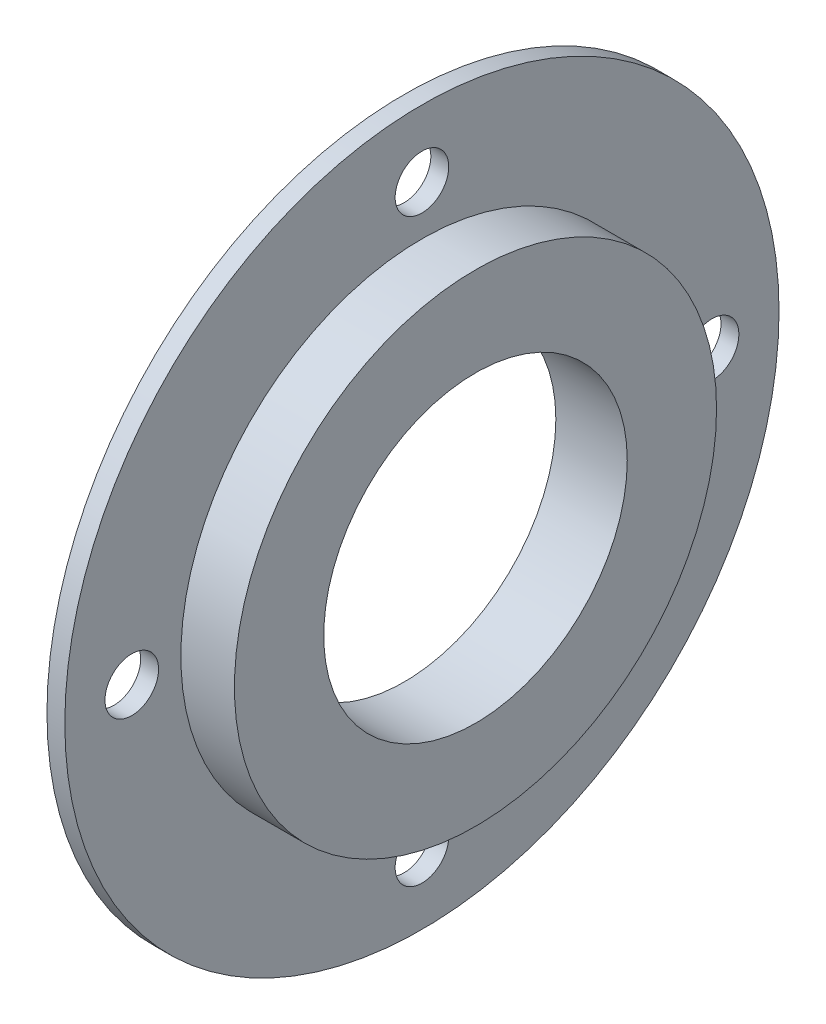
ISO-10303-21;
HEADER;
FILE_DESCRIPTION(('STEP AP214'),'2;1');
FILE_NAME('part.step','',(''),(''),'','','');
FILE_SCHEMA(('AUTOMOTIVE_DESIGN { 1 0 10303 214 1 1 1 1 }'));
ENDSEC;
DATA;
#1=APPLICATION_CONTEXT('core data for automotive mechanical design processes');
#2=APPLICATION_PROTOCOL_DEFINITION('international standard','automotive_design',2000,#1);
#3=PRODUCT_CONTEXT('',#1,'mechanical');
#4=PRODUCT('Part','Part','',(#3));
#5=PRODUCT_RELATED_PRODUCT_CATEGORY('part','',(#4));
#6=PRODUCT_DEFINITION_FORMATION('','',#4);
#7=PRODUCT_DEFINITION_CONTEXT('part definition',#1,'design');
#8=PRODUCT_DEFINITION('design','',#6,#7);
#9=PRODUCT_DEFINITION_SHAPE('','',#8);
#10=(LENGTH_UNIT() NAMED_UNIT(*) SI_UNIT(.MILLI.,.METRE.));
#11=(NAMED_UNIT(*) PLANE_ANGLE_UNIT() SI_UNIT($,.RADIAN.));
#12=(NAMED_UNIT(*) SI_UNIT($,.STERADIAN.) SOLID_ANGLE_UNIT());
#13=UNCERTAINTY_MEASURE_WITH_UNIT(LENGTH_MEASURE(1.E-05),#10,'distance_accuracy_value','');
#14=(GEOMETRIC_REPRESENTATION_CONTEXT(3) GLOBAL_UNCERTAINTY_ASSIGNED_CONTEXT((#13)) GLOBAL_UNIT_ASSIGNED_CONTEXT((#10,
#11,#12)) REPRESENTATION_CONTEXT('',''));
#15=CARTESIAN_POINT('',(0.,0.,0.));
#16=DIRECTION('',(0.,0.,1.));
#17=DIRECTION('',(1.,0.,0.));
#18=AXIS2_PLACEMENT_3D('',#15,#16,#17);
#19=CARTESIAN_POINT('',(0.,0.,0.));
#20=DIRECTION('',(-1.,0.,0.));
#21=DIRECTION('',(0.,0.,1.));
#22=AXIS2_PLACEMENT_3D('',#19,#20,#21);
#23=PLANE('',#22);
#24=CARTESIAN_POINT('',(0.,-32.5,0.));
#25=DIRECTION('',(-1.,0.,0.));
#26=DIRECTION('',(0.,0.,1.));
#27=AXIS2_PLACEMENT_3D('',#24,#25,#26);
#28=CIRCLE('',#27,3.);
#29=CARTESIAN_POINT('',(0.,-32.5,3.));
#30=VERTEX_POINT('',#29);
#31=EDGE_CURVE('E66',#30,#30,#28,.T.);
#32=ORIENTED_EDGE('',*,*,#31,.F.);
#33=EDGE_LOOP('',(#32));
#34=FACE_BOUND('',#33,.T.);
#35=CARTESIAN_POINT('',(0.,0.,-32.5));
#36=DIRECTION('',(-1.,0.,0.));
#37=DIRECTION('',(0.,0.,1.));
#38=AXIS2_PLACEMENT_3D('',#35,#36,#37);
#39=CIRCLE('',#38,3.);
#40=CARTESIAN_POINT('',(0.,0.,-29.5));
#41=VERTEX_POINT('',#40);
#42=EDGE_CURVE('E55',#41,#41,#39,.T.);
#43=ORIENTED_EDGE('',*,*,#42,.F.);
#44=EDGE_LOOP('',(#43));
#45=FACE_BOUND('',#44,.T.);
#46=CARTESIAN_POINT('',(0.,32.5,0.));
#47=DIRECTION('',(-1.,0.,0.));
#48=DIRECTION('',(0.,0.,1.));
#49=AXIS2_PLACEMENT_3D('',#46,#47,#48);
#50=CIRCLE('',#49,3.);
#51=CARTESIAN_POINT('',(0.,32.5,3.));
#52=VERTEX_POINT('',#51);
#53=EDGE_CURVE('E52',#52,#52,#50,.T.);
#54=ORIENTED_EDGE('',*,*,#53,.F.);
#55=EDGE_LOOP('',(#54));
#56=FACE_BOUND('',#55,.T.);
#57=CARTESIAN_POINT('',(0.,0.,32.5));
#58=DIRECTION('',(-1.,0.,0.));
#59=DIRECTION('',(0.,0.,1.));
#60=AXIS2_PLACEMENT_3D('',#57,#58,#59);
#61=CIRCLE('',#60,3.);
#62=CARTESIAN_POINT('',(0.,0.,35.5));
#63=VERTEX_POINT('',#62);
#64=EDGE_CURVE('E49',#63,#63,#61,.T.);
#65=ORIENTED_EDGE('',*,*,#64,.F.);
#66=EDGE_LOOP('',(#65));
#67=FACE_BOUND('',#66,.T.);
#68=CARTESIAN_POINT('',(0.,0.,0.));
#69=DIRECTION('',(-1.,0.,0.));
#70=DIRECTION('',(0.,0.,1.));
#71=AXIS2_PLACEMENT_3D('',#68,#69,#70);
#72=CIRCLE('',#71,17.);
#73=CARTESIAN_POINT('',(0.,0.,17.));
#74=VERTEX_POINT('',#73);
#75=EDGE_CURVE('E72',#74,#74,#72,.T.);
#76=ORIENTED_EDGE('',*,*,#75,.F.);
#77=EDGE_LOOP('',(#76));
#78=FACE_BOUND('',#77,.T.);
#79=CARTESIAN_POINT('',(0.,0.,0.));
#80=DIRECTION('',(1.,0.,0.));
#81=DIRECTION('',(0.,0.,-1.));
#82=AXIS2_PLACEMENT_3D('',#79,#80,#81);
#83=CIRCLE('',#82,40.);
#84=CARTESIAN_POINT('',(0.,0.,-40.));
#85=VERTEX_POINT('',#84);
#86=EDGE_CURVE('E10',#85,#85,#83,.T.);
#87=ORIENTED_EDGE('',*,*,#86,.F.);
#88=EDGE_LOOP('',(#87));
#89=FACE_BOUND('',#88,.T.);
#90=ADVANCED_FACE('F30',(#34,#45,#56,#67,#78,#89),#23,.T.);
#91=CARTESIAN_POINT('',(8.,0.,0.));
#92=DIRECTION('',(1.,0.,0.));
#93=DIRECTION('',(0.,0.,-1.));
#94=AXIS2_PLACEMENT_3D('',#91,#92,#93);
#95=CYLINDRICAL_SURFACE('',#94,40.);
#96=ORIENTED_EDGE('',*,*,#86,.T.);
#97=EDGE_LOOP('',(#96));
#98=FACE_BOUND('',#97,.T.);
#99=CARTESIAN_POINT('',(2.,0.,0.));
#100=DIRECTION('',(1.,0.,0.));
#101=DIRECTION('',(0.,0.,-1.));
#102=AXIS2_PLACEMENT_3D('',#99,#100,#101);
#103=CIRCLE('',#102,40.);
#104=CARTESIAN_POINT('',(2.,0.,-40.));
#105=VERTEX_POINT('',#104);
#106=EDGE_CURVE('E37',#105,#105,#103,.T.);
#107=ORIENTED_EDGE('',*,*,#106,.F.);
#108=EDGE_LOOP('',(#107));
#109=FACE_BOUND('',#108,.T.);
#110=ADVANCED_FACE('F85',(#98,#109),#95,.T.);
#111=CARTESIAN_POINT('',(2.,40.,0.));
#112=DIRECTION('',(1.,0.,0.));
#113=DIRECTION('',(0.,0.,-1.));
#114=AXIS2_PLACEMENT_3D('',#111,#112,#113);
#115=PLANE('',#114);
#116=CARTESIAN_POINT('',(2.,-32.5,0.));
#117=DIRECTION('',(1.,0.,0.));
#118=DIRECTION('',(0.,0.,-1.));
#119=AXIS2_PLACEMENT_3D('',#116,#117,#118);
#120=CIRCLE('',#119,3.);
#121=CARTESIAN_POINT('',(2.,-32.5,-3.));
#122=VERTEX_POINT('',#121);
#123=EDGE_CURVE('E33',#122,#122,#120,.T.);
#124=ORIENTED_EDGE('',*,*,#123,.F.);
#125=EDGE_LOOP('',(#124));
#126=FACE_BOUND('',#125,.T.);
#127=CARTESIAN_POINT('',(2.,0.,-32.5));
#128=DIRECTION('',(1.,0.,0.));
#129=DIRECTION('',(0.,0.,-1.));
#130=AXIS2_PLACEMENT_3D('',#127,#128,#129);
#131=CIRCLE('',#130,3.);
#132=CARTESIAN_POINT('',(2.,0.,-35.5));
#133=VERTEX_POINT('',#132);
#134=EDGE_CURVE('E53',#133,#133,#131,.T.);
#135=ORIENTED_EDGE('',*,*,#134,.F.);
#136=EDGE_LOOP('',(#135));
#137=FACE_BOUND('',#136,.T.);
#138=CARTESIAN_POINT('',(2.,32.5,0.));
#139=DIRECTION('',(1.,0.,0.));
#140=DIRECTION('',(0.,0.,-1.));
#141=AXIS2_PLACEMENT_3D('',#138,#139,#140);
#142=CIRCLE('',#141,3.);
#143=CARTESIAN_POINT('',(2.,32.5,-3.));
#144=VERTEX_POINT('',#143);
#145=EDGE_CURVE('E50',#144,#144,#142,.T.);
#146=ORIENTED_EDGE('',*,*,#145,.F.);
#147=EDGE_LOOP('',(#146));
#148=FACE_BOUND('',#147,.T.);
#149=CARTESIAN_POINT('',(2.,0.,32.5));
#150=DIRECTION('',(1.,0.,0.));
#151=DIRECTION('',(0.,0.,-1.));
#152=AXIS2_PLACEMENT_3D('',#149,#150,#151);
#153=CIRCLE('',#152,3.);
#154=CARTESIAN_POINT('',(2.,0.,29.5));
#155=VERTEX_POINT('',#154);
#156=EDGE_CURVE('E46',#155,#155,#153,.T.);
#157=ORIENTED_EDGE('',*,*,#156,.F.);
#158=EDGE_LOOP('',(#157));
#159=FACE_BOUND('',#158,.T.);
#160=ORIENTED_EDGE('',*,*,#106,.T.);
#161=EDGE_LOOP('',(#160));
#162=FACE_BOUND('',#161,.T.);
#163=CARTESIAN_POINT('',(2.,0.,0.));
#164=DIRECTION('',(1.,0.,0.));
#165=DIRECTION('',(0.,0.,-1.));
#166=AXIS2_PLACEMENT_3D('',#163,#164,#165);
#167=CIRCLE('',#166,27.);
#168=CARTESIAN_POINT('',(2.,0.,-27.));
#169=VERTEX_POINT('',#168);
#170=EDGE_CURVE('E42',#169,#169,#167,.T.);
#171=ORIENTED_EDGE('',*,*,#170,.F.);
#172=EDGE_LOOP('',(#171));
#173=FACE_BOUND('',#172,.T.);
#174=ADVANCED_FACE('F83',(#126,#137,#148,#159,#162,#173),#115,.T.);
#175=CARTESIAN_POINT('',(8.,0.,0.));
#176=DIRECTION('',(1.,0.,0.));
#177=DIRECTION('',(0.,0.,-1.));
#178=AXIS2_PLACEMENT_3D('',#175,#176,#177);
#179=CYLINDRICAL_SURFACE('',#178,27.);
#180=ORIENTED_EDGE('',*,*,#170,.T.);
#181=EDGE_LOOP('',(#180));
#182=FACE_BOUND('',#181,.T.);
#183=CARTESIAN_POINT('',(8.,0.,0.));
#184=DIRECTION('',(1.,0.,0.));
#185=DIRECTION('',(0.,0.,-1.));
#186=AXIS2_PLACEMENT_3D('',#183,#184,#185);
#187=CIRCLE('',#186,27.);
#188=CARTESIAN_POINT('',(8.,0.,-27.));
#189=VERTEX_POINT('',#188);
#190=EDGE_CURVE('E75',#189,#189,#187,.T.);
#191=ORIENTED_EDGE('',*,*,#190,.F.);
#192=EDGE_LOOP('',(#191));
#193=FACE_BOUND('',#192,.T.);
#194=ADVANCED_FACE('F80',(#182,#193),#179,.T.);
#195=CARTESIAN_POINT('',(8.,27.,0.));
#196=DIRECTION('',(1.,0.,0.));
#197=DIRECTION('',(0.,0.,-1.));
#198=AXIS2_PLACEMENT_3D('',#195,#196,#197);
#199=PLANE('',#198);
#200=CARTESIAN_POINT('',(8.,0.,0.));
#201=DIRECTION('',(1.,0.,0.));
#202=DIRECTION('',(0.,0.,-1.));
#203=AXIS2_PLACEMENT_3D('',#200,#201,#202);
#204=CIRCLE('',#203,17.);
#205=CARTESIAN_POINT('',(8.,0.,-17.));
#206=VERTEX_POINT('',#205);
#207=EDGE_CURVE('E69',#206,#206,#204,.T.);
#208=ORIENTED_EDGE('',*,*,#207,.F.);
#209=EDGE_LOOP('',(#208));
#210=FACE_BOUND('',#209,.T.);
#211=ORIENTED_EDGE('',*,*,#190,.T.);
#212=EDGE_LOOP('',(#211));
#213=FACE_BOUND('',#212,.T.);
#214=ADVANCED_FACE('F92',(#210,#213),#199,.T.);
#215=CARTESIAN_POINT('',(-2.,0.,0.));
#216=DIRECTION('',(1.,0.,0.));
#217=DIRECTION('',(0.,0.,-1.));
#218=AXIS2_PLACEMENT_3D('',#215,#216,#217);
#219=CYLINDRICAL_SURFACE('',#218,17.);
#220=ORIENTED_EDGE('',*,*,#75,.T.);
#221=EDGE_LOOP('',(#220));
#222=FACE_BOUND('',#221,.T.);
#223=ORIENTED_EDGE('',*,*,#207,.T.);
#224=EDGE_LOOP('',(#223));
#225=FACE_BOUND('',#224,.T.);
#226=ADVANCED_FACE('F111',(#222,#225),#219,.F.);
#227=CARTESIAN_POINT('',(-20.,0.,32.5));
#228=DIRECTION('',(1.,0.,0.));
#229=DIRECTION('',(0.,0.,-1.));
#230=AXIS2_PLACEMENT_3D('',#227,#228,#229);
#231=CYLINDRICAL_SURFACE('',#230,3.);
#232=ORIENTED_EDGE('',*,*,#64,.T.);
#233=EDGE_LOOP('',(#232));
#234=FACE_BOUND('',#233,.T.);
#235=ORIENTED_EDGE('',*,*,#156,.T.);
#236=EDGE_LOOP('',(#235));
#237=FACE_BOUND('',#236,.T.);
#238=ADVANCED_FACE('F114',(#234,#237),#231,.F.);
#239=CARTESIAN_POINT('',(-20.,32.5,0.));
#240=DIRECTION('',(1.,0.,0.));
#241=DIRECTION('',(0.,0.,-1.));
#242=AXIS2_PLACEMENT_3D('',#239,#240,#241);
#243=CYLINDRICAL_SURFACE('',#242,3.);
#244=ORIENTED_EDGE('',*,*,#53,.T.);
#245=EDGE_LOOP('',(#244));
#246=FACE_BOUND('',#245,.T.);
#247=ORIENTED_EDGE('',*,*,#145,.T.);
#248=EDGE_LOOP('',(#247));
#249=FACE_BOUND('',#248,.T.);
#250=ADVANCED_FACE('F127',(#246,#249),#243,.F.);
#251=CARTESIAN_POINT('',(-20.,0.,-32.5));
#252=DIRECTION('',(1.,0.,0.));
#253=DIRECTION('',(0.,0.,-1.));
#254=AXIS2_PLACEMENT_3D('',#251,#252,#253);
#255=CYLINDRICAL_SURFACE('',#254,3.);
#256=ORIENTED_EDGE('',*,*,#42,.T.);
#257=EDGE_LOOP('',(#256));
#258=FACE_BOUND('',#257,.T.);
#259=ORIENTED_EDGE('',*,*,#134,.T.);
#260=EDGE_LOOP('',(#259));
#261=FACE_BOUND('',#260,.T.);
#262=ADVANCED_FACE('F131',(#258,#261),#255,.F.);
#263=CARTESIAN_POINT('',(-20.,-32.5,0.));
#264=DIRECTION('',(1.,0.,0.));
#265=DIRECTION('',(0.,0.,-1.));
#266=AXIS2_PLACEMENT_3D('',#263,#264,#265);
#267=CYLINDRICAL_SURFACE('',#266,3.);
#268=ORIENTED_EDGE('',*,*,#31,.T.);
#269=EDGE_LOOP('',(#268));
#270=FACE_BOUND('',#269,.T.);
#271=ORIENTED_EDGE('',*,*,#123,.T.);
#272=EDGE_LOOP('',(#271));
#273=FACE_BOUND('',#272,.T.);
#274=ADVANCED_FACE('F134',(#270,#273),#267,.F.);
#275=CLOSED_SHELL('',(#90,#110,#174,#194,#214,#226,#238,#250,#262,#274));
#276=MANIFOLD_SOLID_BREP('B2',#275);
#277=ADVANCED_BREP_SHAPE_REPRESENTATION('',(#18,#276),#14);
#278=SHAPE_DEFINITION_REPRESENTATION(#9,#277);
ENDSEC;
END-ISO-10303-21;
